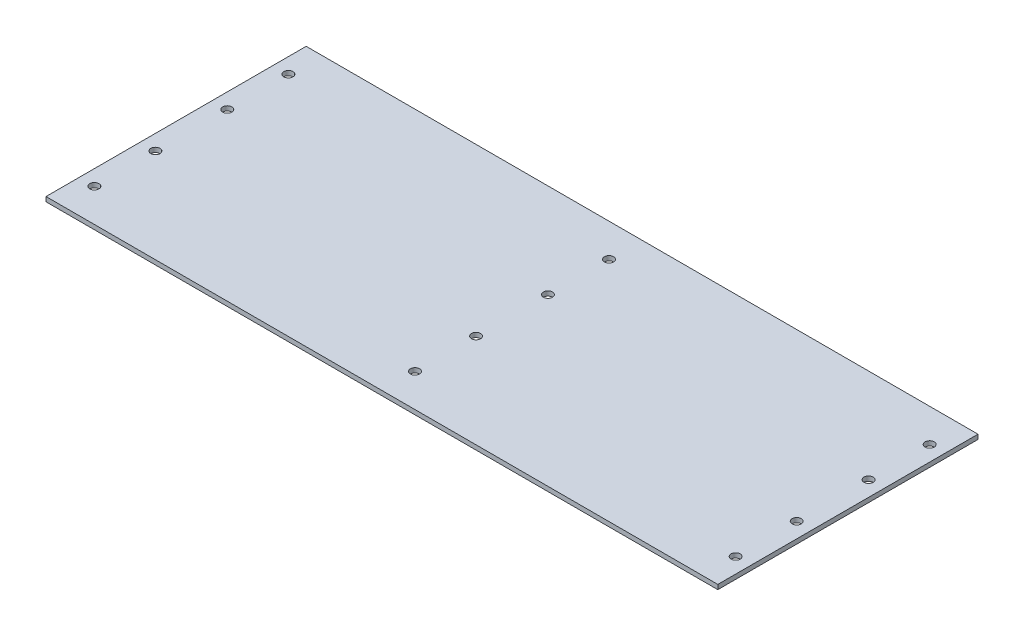
ISO-10303-21;
HEADER;
FILE_DESCRIPTION(('STEP AP214'),'2;1');
FILE_NAME('part.step','',(''),(''),'','','');
FILE_SCHEMA(('AUTOMOTIVE_DESIGN { 1 0 10303 214 1 1 1 1 }'));
ENDSEC;
DATA;
#1=APPLICATION_CONTEXT('core data for automotive mechanical design processes');
#2=APPLICATION_PROTOCOL_DEFINITION('international standard','automotive_design',2000,#1);
#3=PRODUCT_CONTEXT('',#1,'mechanical');
#4=PRODUCT('Part','Part','',(#3));
#5=PRODUCT_RELATED_PRODUCT_CATEGORY('part','',(#4));
#6=PRODUCT_DEFINITION_FORMATION('','',#4);
#7=PRODUCT_DEFINITION_CONTEXT('part definition',#1,'design');
#8=PRODUCT_DEFINITION('design','',#6,#7);
#9=PRODUCT_DEFINITION_SHAPE('','',#8);
#10=(LENGTH_UNIT() NAMED_UNIT(*) SI_UNIT(.MILLI.,.METRE.));
#11=(NAMED_UNIT(*) PLANE_ANGLE_UNIT() SI_UNIT($,.RADIAN.));
#12=(NAMED_UNIT(*) SI_UNIT($,.STERADIAN.) SOLID_ANGLE_UNIT());
#13=UNCERTAINTY_MEASURE_WITH_UNIT(LENGTH_MEASURE(1.E-05),#10,'distance_accuracy_value','');
#14=(GEOMETRIC_REPRESENTATION_CONTEXT(3) GLOBAL_UNCERTAINTY_ASSIGNED_CONTEXT((#13)) GLOBAL_UNIT_ASSIGNED_CONTEXT((#10,
#11,#12)) REPRESENTATION_CONTEXT('',''));
#15=CARTESIAN_POINT('',(0.,0.,0.));
#16=DIRECTION('',(0.,0.,1.));
#17=DIRECTION('',(1.,0.,0.));
#18=AXIS2_PLACEMENT_3D('',#15,#16,#17);
#19=CARTESIAN_POINT('',(0.,1.5,0.));
#20=DIRECTION('',(0.,1.,0.));
#21=DIRECTION('',(0.,0.,1.));
#22=AXIS2_PLACEMENT_3D('',#19,#20,#21);
#23=PLANE('',#22);
#24=CARTESIAN_POINT('',(149.295012832051,1.5,-13.4872525947132));
#25=DIRECTION('',(0.,1.,0.));
#26=DIRECTION('',(0.,0.,1.));
#27=AXIS2_PLACEMENT_3D('',#24,#25,#26);
#28=CIRCLE('',#27,1.5);
#29=CARTESIAN_POINT('',(149.295012832051,1.5,-11.9872525947132));
#30=VERTEX_POINT('',#29);
#31=EDGE_CURVE('E318',#30,#30,#28,.F.);
#32=ORIENTED_EDGE('',*,*,#31,.T.);
#33=EDGE_LOOP('',(#32));
#34=FACE_BOUND('',#33,.T.);
#35=CARTESIAN_POINT('',(-60.704987167949,1.5,-33.4872525947146));
#36=DIRECTION('',(0.,1.,0.));
#37=DIRECTION('',(0.,0.,1.));
#38=AXIS2_PLACEMENT_3D('',#35,#36,#37);
#39=CIRCLE('',#38,1.5);
#40=CARTESIAN_POINT('',(-60.704987167949,1.5,-31.9872525947146));
#41=VERTEX_POINT('',#40);
#42=EDGE_CURVE('E327',#41,#41,#39,.F.);
#43=ORIENTED_EDGE('',*,*,#42,.T.);
#44=EDGE_LOOP('',(#43));
#45=FACE_BOUND('',#44,.T.);
#46=CARTESIAN_POINT('',(149.295012832051,1.5,10.0527474052838));
#47=DIRECTION('',(0.,1.,0.));
#48=DIRECTION('',(0.,0.,1.));
#49=AXIS2_PLACEMENT_3D('',#46,#47,#48);
#50=CIRCLE('',#49,1.5);
#51=CARTESIAN_POINT('',(149.295012832051,1.5,11.5527474052838));
#52=VERTEX_POINT('',#51);
#53=EDGE_CURVE('E333',#52,#52,#50,.T.);
#54=ORIENTED_EDGE('',*,*,#53,.F.);
#55=EDGE_LOOP('',(#54));
#56=FACE_BOUND('',#55,.T.);
#57=CARTESIAN_POINT('',(44.295012832051,1.5,10.0527474052845));
#58=DIRECTION('',(0.,1.,0.));
#59=DIRECTION('',(0.,0.,1.));
#60=AXIS2_PLACEMENT_3D('',#57,#58,#59);
#61=CIRCLE('',#60,1.5);
#62=CARTESIAN_POINT('',(44.295012832051,1.5,11.5527474052845));
#63=VERTEX_POINT('',#62);
#64=EDGE_CURVE('E331',#63,#63,#61,.T.);
#65=ORIENTED_EDGE('',*,*,#64,.F.);
#66=EDGE_LOOP('',(#65));
#67=FACE_BOUND('',#66,.T.);
#68=CARTESIAN_POINT('',(44.2950128320511,1.5,30.0527474052845));
#69=DIRECTION('',(0.,1.,0.));
#70=DIRECTION('',(0.,0.,1.));
#71=AXIS2_PLACEMENT_3D('',#68,#69,#70);
#72=CIRCLE('',#71,1.5);
#73=CARTESIAN_POINT('',(44.2950128320511,1.5,31.5527474052845));
#74=VERTEX_POINT('',#73);
#75=EDGE_CURVE('E321',#74,#74,#72,.T.);
#76=ORIENTED_EDGE('',*,*,#75,.F.);
#77=EDGE_LOOP('',(#76));
#78=FACE_BOUND('',#77,.T.);
#79=CARTESIAN_POINT('',(-60.7049871679491,1.5,-13.4872525947146));
#80=DIRECTION('',(0.,1.,0.));
#81=DIRECTION('',(0.,0.,1.));
#82=AXIS2_PLACEMENT_3D('',#79,#80,#81);
#83=CIRCLE('',#82,1.5);
#84=CARTESIAN_POINT('',(-60.7049871679491,1.5,-11.9872525947146));
#85=VERTEX_POINT('',#84);
#86=EDGE_CURVE('E368',#85,#85,#83,.F.);
#87=ORIENTED_EDGE('',*,*,#86,.T.);
#88=EDGE_LOOP('',(#87));
#89=FACE_BOUND('',#88,.T.);
#90=CARTESIAN_POINT('',(-60.7049871679489,1.5,10.0527474052852));
#91=DIRECTION('',(0.,1.,0.));
#92=DIRECTION('',(0.,0.,1.));
#93=AXIS2_PLACEMENT_3D('',#90,#91,#92);
#94=CIRCLE('',#93,1.5);
#95=CARTESIAN_POINT('',(-60.7049871679489,1.5,11.5527474052852));
#96=VERTEX_POINT('',#95);
#97=EDGE_CURVE('E372',#96,#96,#94,.T.);
#98=ORIENTED_EDGE('',*,*,#97,.F.);
#99=EDGE_LOOP('',(#98));
#100=FACE_BOUND('',#99,.T.);
#101=CARTESIAN_POINT('',(-60.7049871679489,1.5,30.0527474052852));
#102=DIRECTION('',(0.,1.,0.));
#103=DIRECTION('',(0.,0.,1.));
#104=AXIS2_PLACEMENT_3D('',#101,#102,#103);
#105=CIRCLE('',#104,1.5);
#106=CARTESIAN_POINT('',(-60.7049871679489,1.5,31.5527474052852));
#107=VERTEX_POINT('',#106);
#108=EDGE_CURVE('E375',#107,#107,#105,.T.);
#109=ORIENTED_EDGE('',*,*,#108,.F.);
#110=EDGE_LOOP('',(#109));
#111=FACE_BOUND('',#110,.T.);
#112=CARTESIAN_POINT('',(149.295012832051,1.5,30.0527474052838));
#113=DIRECTION('',(0.,1.,0.));
#114=DIRECTION('',(0.,0.,1.));
#115=AXIS2_PLACEMENT_3D('',#112,#113,#114);
#116=CIRCLE('',#115,1.5);
#117=CARTESIAN_POINT('',(149.295012832051,1.5,31.5527474052838));
#118=VERTEX_POINT('',#117);
#119=EDGE_CURVE('E117',#118,#118,#116,.T.);
#120=ORIENTED_EDGE('',*,*,#119,.F.);
#121=EDGE_LOOP('',(#120));
#122=FACE_BOUND('',#121,.T.);
#123=DIRECTION('',(0.,0.,1.));
#124=VECTOR('',#123,1.);
#125=CARTESIAN_POINT('',(-65.7049871679489,1.5,-44.3172525947162));
#126=LINE('',#125,#124);
#127=CARTESIAN_POINT('',(-65.7049871679489,1.5,-44.3172525947162));
#128=VERTEX_POINT('',#127);
#129=CARTESIAN_POINT('',(-65.7049871679489,1.5,40.8827474052838));
#130=VERTEX_POINT('',#129);
#131=EDGE_CURVE('E92',#128,#130,#126,.T.);
#132=ORIENTED_EDGE('',*,*,#131,.T.);
#133=DIRECTION('',(1.,0.,0.));
#134=VECTOR('',#133,1.);
#135=CARTESIAN_POINT('',(-65.7049871679489,1.5,40.8827474052838));
#136=LINE('',#135,#134);
#137=CARTESIAN_POINT('',(154.295012832051,1.5,40.8827474052838));
#138=VERTEX_POINT('',#137);
#139=EDGE_CURVE('E87',#130,#138,#136,.T.);
#140=ORIENTED_EDGE('',*,*,#139,.T.);
#141=DIRECTION('',(0.,0.,-1.));
#142=VECTOR('',#141,1.);
#143=CARTESIAN_POINT('',(154.295012832051,1.5,-44.3172525947162));
#144=LINE('',#143,#142);
#145=CARTESIAN_POINT('',(154.295012832051,1.5,-44.3172525947162));
#146=VERTEX_POINT('',#145);
#147=EDGE_CURVE('E90',#138,#146,#144,.T.);
#148=ORIENTED_EDGE('',*,*,#147,.T.);
#149=DIRECTION('',(-1.,0.,0.));
#150=VECTOR('',#149,1.);
#151=CARTESIAN_POINT('',(-65.7049871679489,1.5,-44.3172525947162));
#152=LINE('',#151,#150);
#153=EDGE_CURVE('E57',#146,#128,#152,.T.);
#154=ORIENTED_EDGE('',*,*,#153,.T.);
#155=EDGE_LOOP('',(#132,#140,#148,#154));
#156=FACE_BOUND('',#155,.T.);
#157=CARTESIAN_POINT('',(44.2950128320509,1.5,-13.4872525947139));
#158=DIRECTION('',(0.,1.,0.));
#159=DIRECTION('',(0.,0.,1.));
#160=AXIS2_PLACEMENT_3D('',#157,#158,#159);
#161=CIRCLE('',#160,1.5);
#162=CARTESIAN_POINT('',(44.2950128320509,1.5,-11.9872525947139));
#163=VERTEX_POINT('',#162);
#164=EDGE_CURVE('E317',#163,#163,#161,.F.);
#165=ORIENTED_EDGE('',*,*,#164,.T.);
#166=EDGE_LOOP('',(#165));
#167=FACE_BOUND('',#166,.T.);
#168=CARTESIAN_POINT('',(149.295012832051,1.5,-33.4872525947132));
#169=DIRECTION('',(0.,1.,0.));
#170=DIRECTION('',(0.,0.,1.));
#171=AXIS2_PLACEMENT_3D('',#168,#169,#170);
#172=CIRCLE('',#171,1.5);
#173=CARTESIAN_POINT('',(149.295012832051,1.5,-31.9872525947132));
#174=VERTEX_POINT('',#173);
#175=EDGE_CURVE('E324',#174,#174,#172,.F.);
#176=ORIENTED_EDGE('',*,*,#175,.T.);
#177=EDGE_LOOP('',(#176));
#178=FACE_BOUND('',#177,.T.);
#179=CARTESIAN_POINT('',(44.295012832051,1.5,-33.4872525947139));
#180=DIRECTION('',(0.,1.,0.));
#181=DIRECTION('',(0.,0.,1.));
#182=AXIS2_PLACEMENT_3D('',#179,#180,#181);
#183=CIRCLE('',#182,1.5);
#184=CARTESIAN_POINT('',(44.295012832051,1.5,-31.9872525947139));
#185=VERTEX_POINT('',#184);
#186=EDGE_CURVE('E315',#185,#185,#183,.F.);
#187=ORIENTED_EDGE('',*,*,#186,.T.);
#188=EDGE_LOOP('',(#187));
#189=FACE_BOUND('',#188,.T.);
#190=ADVANCED_FACE('F38',(#34,#45,#56,#67,#78,#89,#100,#111,#122,#156,#167,#178,#189),#23,.T.);
#191=CARTESIAN_POINT('',(0.,0.,0.));
#192=DIRECTION('',(0.,1.,0.));
#193=DIRECTION('',(0.,0.,1.));
#194=AXIS2_PLACEMENT_3D('',#191,#192,#193);
#195=PLANE('',#194);
#196=CARTESIAN_POINT('',(149.295012832051,0.,10.0527474052838));
#197=DIRECTION('',(0.,1.,0.));
#198=DIRECTION('',(0.,0.,1.));
#199=AXIS2_PLACEMENT_3D('',#196,#197,#198);
#200=CIRCLE('',#199,1.5);
#201=CARTESIAN_POINT('',(149.295012832051,0.,11.5527474052838));
#202=VERTEX_POINT('',#201);
#203=EDGE_CURVE('E135',#202,#202,#200,.T.);
#204=ORIENTED_EDGE('',*,*,#203,.T.);
#205=EDGE_LOOP('',(#204));
#206=FACE_BOUND('',#205,.T.);
#207=CARTESIAN_POINT('',(44.295012832051,0.,10.0527474052845));
#208=DIRECTION('',(0.,1.,0.));
#209=DIRECTION('',(0.,0.,1.));
#210=AXIS2_PLACEMENT_3D('',#207,#208,#209);
#211=CIRCLE('',#210,1.5);
#212=CARTESIAN_POINT('',(44.295012832051,0.,11.5527474052845));
#213=VERTEX_POINT('',#212);
#214=EDGE_CURVE('E132',#213,#213,#211,.T.);
#215=ORIENTED_EDGE('',*,*,#214,.T.);
#216=EDGE_LOOP('',(#215));
#217=FACE_BOUND('',#216,.T.);
#218=CARTESIAN_POINT('',(44.2950128320511,0.,30.0527474052845));
#219=DIRECTION('',(0.,1.,0.));
#220=DIRECTION('',(0.,0.,1.));
#221=AXIS2_PLACEMENT_3D('',#218,#219,#220);
#222=CIRCLE('',#221,1.5);
#223=CARTESIAN_POINT('',(44.2950128320511,0.,31.5527474052845));
#224=VERTEX_POINT('',#223);
#225=EDGE_CURVE('E129',#224,#224,#222,.T.);
#226=ORIENTED_EDGE('',*,*,#225,.T.);
#227=EDGE_LOOP('',(#226));
#228=FACE_BOUND('',#227,.T.);
#229=CARTESIAN_POINT('',(-60.7049871679489,0.,10.0527474052852));
#230=DIRECTION('',(0.,1.,0.));
#231=DIRECTION('',(0.,0.,1.));
#232=AXIS2_PLACEMENT_3D('',#229,#230,#231);
#233=CIRCLE('',#232,1.5);
#234=CARTESIAN_POINT('',(-60.7049871679489,0.,11.5527474052852));
#235=VERTEX_POINT('',#234);
#236=EDGE_CURVE('E120',#235,#235,#233,.T.);
#237=ORIENTED_EDGE('',*,*,#236,.T.);
#238=EDGE_LOOP('',(#237));
#239=FACE_BOUND('',#238,.T.);
#240=CARTESIAN_POINT('',(-60.7049871679489,0.,30.0527474052852));
#241=DIRECTION('',(0.,1.,0.));
#242=DIRECTION('',(0.,0.,1.));
#243=AXIS2_PLACEMENT_3D('',#240,#241,#242);
#244=CIRCLE('',#243,1.5);
#245=CARTESIAN_POINT('',(-60.7049871679489,0.,31.5527474052852));
#246=VERTEX_POINT('',#245);
#247=EDGE_CURVE('E116',#246,#246,#244,.T.);
#248=ORIENTED_EDGE('',*,*,#247,.T.);
#249=EDGE_LOOP('',(#248));
#250=FACE_BOUND('',#249,.T.);
#251=CARTESIAN_POINT('',(149.295012832051,0.,30.0527474052838));
#252=DIRECTION('',(0.,1.,0.));
#253=DIRECTION('',(0.,0.,1.));
#254=AXIS2_PLACEMENT_3D('',#251,#252,#253);
#255=CIRCLE('',#254,1.5);
#256=CARTESIAN_POINT('',(149.295012832051,0.,31.5527474052838));
#257=VERTEX_POINT('',#256);
#258=EDGE_CURVE('E113',#257,#257,#255,.T.);
#259=ORIENTED_EDGE('',*,*,#258,.T.);
#260=EDGE_LOOP('',(#259));
#261=FACE_BOUND('',#260,.T.);
#262=DIRECTION('',(0.,0.,1.));
#263=VECTOR('',#262,1.);
#264=CARTESIAN_POINT('',(-65.7049871679489,0.,-44.3172525947162));
#265=LINE('',#264,#263);
#266=CARTESIAN_POINT('',(-65.7049871679489,0.,-44.3172525947162));
#267=VERTEX_POINT('',#266);
#268=CARTESIAN_POINT('',(-65.7049871679489,0.,40.8827474052838));
#269=VERTEX_POINT('',#268);
#270=EDGE_CURVE('E105',#267,#269,#265,.T.);
#271=ORIENTED_EDGE('',*,*,#270,.F.);
#272=DIRECTION('',(-1.,0.,0.));
#273=VECTOR('',#272,1.);
#274=CARTESIAN_POINT('',(-65.7049871679489,0.,-44.3172525947162));
#275=LINE('',#274,#273);
#276=CARTESIAN_POINT('',(154.295012832051,0.,-44.3172525947162));
#277=VERTEX_POINT('',#276);
#278=EDGE_CURVE('E80',#277,#267,#275,.T.);
#279=ORIENTED_EDGE('',*,*,#278,.F.);
#280=DIRECTION('',(0.,0.,-1.));
#281=VECTOR('',#280,1.);
#282=CARTESIAN_POINT('',(154.295012832051,0.,-44.3172525947162));
#283=LINE('',#282,#281);
#284=CARTESIAN_POINT('',(154.295012832051,0.,40.8827474052838));
#285=VERTEX_POINT('',#284);
#286=EDGE_CURVE('E74',#285,#277,#283,.T.);
#287=ORIENTED_EDGE('',*,*,#286,.F.);
#288=DIRECTION('',(1.,0.,0.));
#289=VECTOR('',#288,1.);
#290=CARTESIAN_POINT('',(-65.7049871679489,0.,40.8827474052838));
#291=LINE('',#290,#289);
#292=EDGE_CURVE('E96',#269,#285,#291,.T.);
#293=ORIENTED_EDGE('',*,*,#292,.F.);
#294=EDGE_LOOP('',(#271,#279,#287,#293));
#295=FACE_BOUND('',#294,.T.);
#296=CARTESIAN_POINT('',(-60.7049871679491,0.,-13.4872525947146));
#297=DIRECTION('',(0.,1.,0.));
#298=DIRECTION('',(0.,0.,1.));
#299=AXIS2_PLACEMENT_3D('',#296,#297,#298);
#300=CIRCLE('',#299,1.5);
#301=CARTESIAN_POINT('',(-60.7049871679491,0.,-11.9872525947146));
#302=VERTEX_POINT('',#301);
#303=EDGE_CURVE('E123',#302,#302,#300,.F.);
#304=ORIENTED_EDGE('',*,*,#303,.F.);
#305=EDGE_LOOP('',(#304));
#306=FACE_BOUND('',#305,.T.);
#307=CARTESIAN_POINT('',(44.2950128320509,0.,-13.4872525947139));
#308=DIRECTION('',(0.,1.,0.));
#309=DIRECTION('',(0.,0.,1.));
#310=AXIS2_PLACEMENT_3D('',#307,#308,#309);
#311=CIRCLE('',#310,1.5);
#312=CARTESIAN_POINT('',(44.2950128320509,0.,-11.9872525947139));
#313=VERTEX_POINT('',#312);
#314=EDGE_CURVE('E126',#313,#313,#311,.F.);
#315=ORIENTED_EDGE('',*,*,#314,.F.);
#316=EDGE_LOOP('',(#315));
#317=FACE_BOUND('',#316,.T.);
#318=CARTESIAN_POINT('',(-60.704987167949,0.,-33.4872525947146));
#319=DIRECTION('',(0.,1.,0.));
#320=DIRECTION('',(0.,0.,1.));
#321=AXIS2_PLACEMENT_3D('',#318,#319,#320);
#322=CIRCLE('',#321,1.5);
#323=CARTESIAN_POINT('',(-60.704987167949,0.,-31.9872525947146));
#324=VERTEX_POINT('',#323);
#325=EDGE_CURVE('E138',#324,#324,#322,.F.);
#326=ORIENTED_EDGE('',*,*,#325,.F.);
#327=EDGE_LOOP('',(#326));
#328=FACE_BOUND('',#327,.T.);
#329=CARTESIAN_POINT('',(149.295012832051,0.,-33.4872525947132));
#330=DIRECTION('',(0.,1.,0.));
#331=DIRECTION('',(0.,0.,1.));
#332=AXIS2_PLACEMENT_3D('',#329,#330,#331);
#333=CIRCLE('',#332,1.5);
#334=CARTESIAN_POINT('',(149.295012832051,0.,-31.9872525947132));
#335=VERTEX_POINT('',#334);
#336=EDGE_CURVE('E141',#335,#335,#333,.F.);
#337=ORIENTED_EDGE('',*,*,#336,.F.);
#338=EDGE_LOOP('',(#337));
#339=FACE_BOUND('',#338,.T.);
#340=CARTESIAN_POINT('',(149.295012832051,0.,-13.4872525947132));
#341=DIRECTION('',(0.,1.,0.));
#342=DIRECTION('',(0.,0.,1.));
#343=AXIS2_PLACEMENT_3D('',#340,#341,#342);
#344=CIRCLE('',#343,1.5);
#345=CARTESIAN_POINT('',(149.295012832051,0.,-11.9872525947132));
#346=VERTEX_POINT('',#345);
#347=EDGE_CURVE('E143',#346,#346,#344,.F.);
#348=ORIENTED_EDGE('',*,*,#347,.F.);
#349=EDGE_LOOP('',(#348));
#350=FACE_BOUND('',#349,.T.);
#351=CARTESIAN_POINT('',(44.295012832051,0.,-33.4872525947139));
#352=DIRECTION('',(0.,1.,0.));
#353=DIRECTION('',(0.,0.,1.));
#354=AXIS2_PLACEMENT_3D('',#351,#352,#353);
#355=CIRCLE('',#354,1.5);
#356=CARTESIAN_POINT('',(44.295012832051,0.,-31.9872525947139));
#357=VERTEX_POINT('',#356);
#358=EDGE_CURVE('E42',#357,#357,#355,.F.);
#359=ORIENTED_EDGE('',*,*,#358,.F.);
#360=EDGE_LOOP('',(#359));
#361=FACE_BOUND('',#360,.T.);
#362=ADVANCED_FACE('F152',(#206,#217,#228,#239,#250,#261,#295,#306,#317,#328,#339,#350,#361),
#195,.F.);
#363=CARTESIAN_POINT('',(-65.7049871679489,1.5,-44.3172525947162));
#364=DIRECTION('',(1.,0.,0.));
#365=DIRECTION('',(0.,0.,-1.));
#366=AXIS2_PLACEMENT_3D('',#363,#364,#365);
#367=PLANE('',#366);
#368=ORIENTED_EDGE('',*,*,#270,.T.);
#369=DIRECTION('',(0.,-1.,0.));
#370=VECTOR('',#369,1.);
#371=CARTESIAN_POINT('',(-65.7049871679489,1.5,40.8827474052838));
#372=LINE('',#371,#370);
#373=EDGE_CURVE('E11',#130,#269,#372,.T.);
#374=ORIENTED_EDGE('',*,*,#373,.F.);
#375=ORIENTED_EDGE('',*,*,#131,.F.);
#376=DIRECTION('',(0.,-1.,0.));
#377=VECTOR('',#376,1.);
#378=CARTESIAN_POINT('',(-65.7049871679489,1.5,-44.3172525947162));
#379=LINE('',#378,#377);
#380=EDGE_CURVE('E101',#128,#267,#379,.T.);
#381=ORIENTED_EDGE('',*,*,#380,.T.);
#382=EDGE_LOOP('',(#368,#374,#375,#381));
#383=FACE_BOUND('',#382,.T.);
#384=ADVANCED_FACE('F40',(#383),#367,.F.);
#385=CARTESIAN_POINT('',(-65.7049871679489,1.5,40.8827474052838));
#386=DIRECTION('',(0.,0.,-1.));
#387=DIRECTION('',(-1.,0.,0.));
#388=AXIS2_PLACEMENT_3D('',#385,#386,#387);
#389=PLANE('',#388);
#390=ORIENTED_EDGE('',*,*,#292,.T.);
#391=DIRECTION('',(0.,-1.,0.));
#392=VECTOR('',#391,1.);
#393=CARTESIAN_POINT('',(154.295012832051,1.5,40.8827474052838));
#394=LINE('',#393,#392);
#395=EDGE_CURVE('E48',#138,#285,#394,.T.);
#396=ORIENTED_EDGE('',*,*,#395,.F.);
#397=ORIENTED_EDGE('',*,*,#139,.F.);
#398=ORIENTED_EDGE('',*,*,#373,.T.);
#399=EDGE_LOOP('',(#390,#396,#397,#398));
#400=FACE_BOUND('',#399,.T.);
#401=ADVANCED_FACE('F95',(#400),#389,.F.);
#402=CARTESIAN_POINT('',(154.295012832051,1.5,-44.3172525947162));
#403=DIRECTION('',(-1.,0.,0.));
#404=DIRECTION('',(0.,0.,1.));
#405=AXIS2_PLACEMENT_3D('',#402,#403,#404);
#406=PLANE('',#405);
#407=ORIENTED_EDGE('',*,*,#286,.T.);
#408=DIRECTION('',(0.,-1.,0.));
#409=VECTOR('',#408,1.);
#410=CARTESIAN_POINT('',(154.295012832051,1.5,-44.3172525947162));
#411=LINE('',#410,#409);
#412=EDGE_CURVE('E97',#146,#277,#411,.T.);
#413=ORIENTED_EDGE('',*,*,#412,.F.);
#414=ORIENTED_EDGE('',*,*,#147,.F.);
#415=ORIENTED_EDGE('',*,*,#395,.T.);
#416=EDGE_LOOP('',(#407,#413,#414,#415));
#417=FACE_BOUND('',#416,.T.);
#418=ADVANCED_FACE('F99',(#417),#406,.F.);
#419=CARTESIAN_POINT('',(-65.7049871679489,1.5,-44.3172525947162));
#420=DIRECTION('',(0.,0.,1.));
#421=DIRECTION('',(1.,0.,0.));
#422=AXIS2_PLACEMENT_3D('',#419,#420,#421);
#423=PLANE('',#422);
#424=ORIENTED_EDGE('',*,*,#278,.T.);
#425=ORIENTED_EDGE('',*,*,#380,.F.);
#426=ORIENTED_EDGE('',*,*,#153,.F.);
#427=ORIENTED_EDGE('',*,*,#412,.T.);
#428=EDGE_LOOP('',(#424,#425,#426,#427));
#429=FACE_BOUND('',#428,.T.);
#430=ADVANCED_FACE('F167',(#429),#423,.F.);
#431=CARTESIAN_POINT('',(149.295012832051,-8.5,30.0527474052838));
#432=DIRECTION('',(0.,1.,0.));
#433=DIRECTION('',(0.,0.,1.));
#434=AXIS2_PLACEMENT_3D('',#431,#432,#433);
#435=CYLINDRICAL_SURFACE('',#434,1.5);
#436=ORIENTED_EDGE('',*,*,#119,.T.);
#437=EDGE_LOOP('',(#436));
#438=FACE_BOUND('',#437,.T.);
#439=ORIENTED_EDGE('',*,*,#258,.F.);
#440=EDGE_LOOP('',(#439));
#441=FACE_BOUND('',#440,.T.);
#442=ADVANCED_FACE('F170',(#438,#441),#435,.F.);
#443=CARTESIAN_POINT('',(-60.7049871679489,-8.5,30.0527474052852));
#444=DIRECTION('',(0.,1.,0.));
#445=DIRECTION('',(0.,0.,1.));
#446=AXIS2_PLACEMENT_3D('',#443,#444,#445);
#447=CYLINDRICAL_SURFACE('',#446,1.5);
#448=ORIENTED_EDGE('',*,*,#108,.T.);
#449=EDGE_LOOP('',(#448));
#450=FACE_BOUND('',#449,.T.);
#451=ORIENTED_EDGE('',*,*,#247,.F.);
#452=EDGE_LOOP('',(#451));
#453=FACE_BOUND('',#452,.T.);
#454=ADVANCED_FACE('F201',(#450,#453),#447,.F.);
#455=CARTESIAN_POINT('',(-60.7049871679489,-8.5,10.0527474052852));
#456=DIRECTION('',(0.,1.,0.));
#457=DIRECTION('',(0.,0.,1.));
#458=AXIS2_PLACEMENT_3D('',#455,#456,#457);
#459=CYLINDRICAL_SURFACE('',#458,1.5);
#460=ORIENTED_EDGE('',*,*,#97,.T.);
#461=EDGE_LOOP('',(#460));
#462=FACE_BOUND('',#461,.T.);
#463=ORIENTED_EDGE('',*,*,#236,.F.);
#464=EDGE_LOOP('',(#463));
#465=FACE_BOUND('',#464,.T.);
#466=ADVANCED_FACE('F207',(#462,#465),#459,.F.);
#467=CARTESIAN_POINT('',(-60.7049871679491,-8.5,-13.4872525947146));
#468=DIRECTION('',(0.,1.,0.));
#469=DIRECTION('',(0.,0.,1.));
#470=AXIS2_PLACEMENT_3D('',#467,#468,#469);
#471=CYLINDRICAL_SURFACE('',#470,1.5);
#472=ORIENTED_EDGE('',*,*,#86,.F.);
#473=EDGE_LOOP('',(#472));
#474=FACE_BOUND('',#473,.T.);
#475=ORIENTED_EDGE('',*,*,#303,.T.);
#476=EDGE_LOOP('',(#475));
#477=FACE_BOUND('',#476,.T.);
#478=ADVANCED_FACE('F215',(#474,#477),#471,.F.);
#479=CARTESIAN_POINT('',(44.2950128320509,-8.5,-13.4872525947139));
#480=DIRECTION('',(0.,1.,0.));
#481=DIRECTION('',(0.,0.,1.));
#482=AXIS2_PLACEMENT_3D('',#479,#480,#481);
#483=CYLINDRICAL_SURFACE('',#482,1.5);
#484=ORIENTED_EDGE('',*,*,#164,.F.);
#485=EDGE_LOOP('',(#484));
#486=FACE_BOUND('',#485,.T.);
#487=ORIENTED_EDGE('',*,*,#314,.T.);
#488=EDGE_LOOP('',(#487));
#489=FACE_BOUND('',#488,.T.);
#490=ADVANCED_FACE('F223',(#486,#489),#483,.F.);
#491=CARTESIAN_POINT('',(44.2950128320511,-8.5,30.0527474052845));
#492=DIRECTION('',(0.,1.,0.));
#493=DIRECTION('',(0.,0.,1.));
#494=AXIS2_PLACEMENT_3D('',#491,#492,#493);
#495=CYLINDRICAL_SURFACE('',#494,1.5);
#496=ORIENTED_EDGE('',*,*,#75,.T.);
#497=EDGE_LOOP('',(#496));
#498=FACE_BOUND('',#497,.T.);
#499=ORIENTED_EDGE('',*,*,#225,.F.);
#500=EDGE_LOOP('',(#499));
#501=FACE_BOUND('',#500,.T.);
#502=ADVANCED_FACE('F231',(#498,#501),#495,.F.);
#503=CARTESIAN_POINT('',(44.295012832051,-8.5,10.0527474052845));
#504=DIRECTION('',(0.,1.,0.));
#505=DIRECTION('',(0.,0.,1.));
#506=AXIS2_PLACEMENT_3D('',#503,#504,#505);
#507=CYLINDRICAL_SURFACE('',#506,1.5);
#508=ORIENTED_EDGE('',*,*,#64,.T.);
#509=EDGE_LOOP('',(#508));
#510=FACE_BOUND('',#509,.T.);
#511=ORIENTED_EDGE('',*,*,#214,.F.);
#512=EDGE_LOOP('',(#511));
#513=FACE_BOUND('',#512,.T.);
#514=ADVANCED_FACE('F239',(#510,#513),#507,.F.);
#515=CARTESIAN_POINT('',(149.295012832051,-8.5,10.0527474052838));
#516=DIRECTION('',(0.,1.,0.));
#517=DIRECTION('',(0.,0.,1.));
#518=AXIS2_PLACEMENT_3D('',#515,#516,#517);
#519=CYLINDRICAL_SURFACE('',#518,1.5);
#520=ORIENTED_EDGE('',*,*,#53,.T.);
#521=EDGE_LOOP('',(#520));
#522=FACE_BOUND('',#521,.T.);
#523=ORIENTED_EDGE('',*,*,#203,.F.);
#524=EDGE_LOOP('',(#523));
#525=FACE_BOUND('',#524,.T.);
#526=ADVANCED_FACE('F247',(#522,#525),#519,.F.);
#527=CARTESIAN_POINT('',(-60.704987167949,-8.5,-33.4872525947146));
#528=DIRECTION('',(0.,1.,0.));
#529=DIRECTION('',(0.,0.,1.));
#530=AXIS2_PLACEMENT_3D('',#527,#528,#529);
#531=CYLINDRICAL_SURFACE('',#530,1.5);
#532=ORIENTED_EDGE('',*,*,#42,.F.);
#533=EDGE_LOOP('',(#532));
#534=FACE_BOUND('',#533,.T.);
#535=ORIENTED_EDGE('',*,*,#325,.T.);
#536=EDGE_LOOP('',(#535));
#537=FACE_BOUND('',#536,.T.);
#538=ADVANCED_FACE('F255',(#534,#537),#531,.F.);
#539=CARTESIAN_POINT('',(149.295012832051,-8.5,-33.4872525947132));
#540=DIRECTION('',(0.,1.,0.));
#541=DIRECTION('',(0.,0.,1.));
#542=AXIS2_PLACEMENT_3D('',#539,#540,#541);
#543=CYLINDRICAL_SURFACE('',#542,1.5);
#544=ORIENTED_EDGE('',*,*,#175,.F.);
#545=EDGE_LOOP('',(#544));
#546=FACE_BOUND('',#545,.T.);
#547=ORIENTED_EDGE('',*,*,#336,.T.);
#548=EDGE_LOOP('',(#547));
#549=FACE_BOUND('',#548,.T.);
#550=ADVANCED_FACE('F263',(#546,#549),#543,.F.);
#551=CARTESIAN_POINT('',(149.295012832051,-8.5,-13.4872525947132));
#552=DIRECTION('',(0.,1.,0.));
#553=DIRECTION('',(0.,0.,1.));
#554=AXIS2_PLACEMENT_3D('',#551,#552,#553);
#555=CYLINDRICAL_SURFACE('',#554,1.5);
#556=ORIENTED_EDGE('',*,*,#31,.F.);
#557=EDGE_LOOP('',(#556));
#558=FACE_BOUND('',#557,.T.);
#559=ORIENTED_EDGE('',*,*,#347,.T.);
#560=EDGE_LOOP('',(#559));
#561=FACE_BOUND('',#560,.T.);
#562=ADVANCED_FACE('F271',(#558,#561),#555,.F.);
#563=CARTESIAN_POINT('',(44.295012832051,-8.5,-33.4872525947139));
#564=DIRECTION('',(0.,1.,0.));
#565=DIRECTION('',(0.,0.,1.));
#566=AXIS2_PLACEMENT_3D('',#563,#564,#565);
#567=CYLINDRICAL_SURFACE('',#566,1.5);
#568=ORIENTED_EDGE('',*,*,#186,.F.);
#569=EDGE_LOOP('',(#568));
#570=FACE_BOUND('',#569,.T.);
#571=ORIENTED_EDGE('',*,*,#358,.T.);
#572=EDGE_LOOP('',(#571));
#573=FACE_BOUND('',#572,.T.);
#574=ADVANCED_FACE('F150',(#570,#573),#567,.F.);
#575=CLOSED_SHELL('',(#190,#362,#384,#401,#418,#430,#442,#454,#466,#478,#490,#502,#514,#526,
#538,#550,#562,#574));
#576=MANIFOLD_SOLID_BREP('B2',#575);
#577=ADVANCED_BREP_SHAPE_REPRESENTATION('',(#18,#576),#14);
#578=SHAPE_DEFINITION_REPRESENTATION(#9,#577);
ENDSEC;
END-ISO-10303-21;
